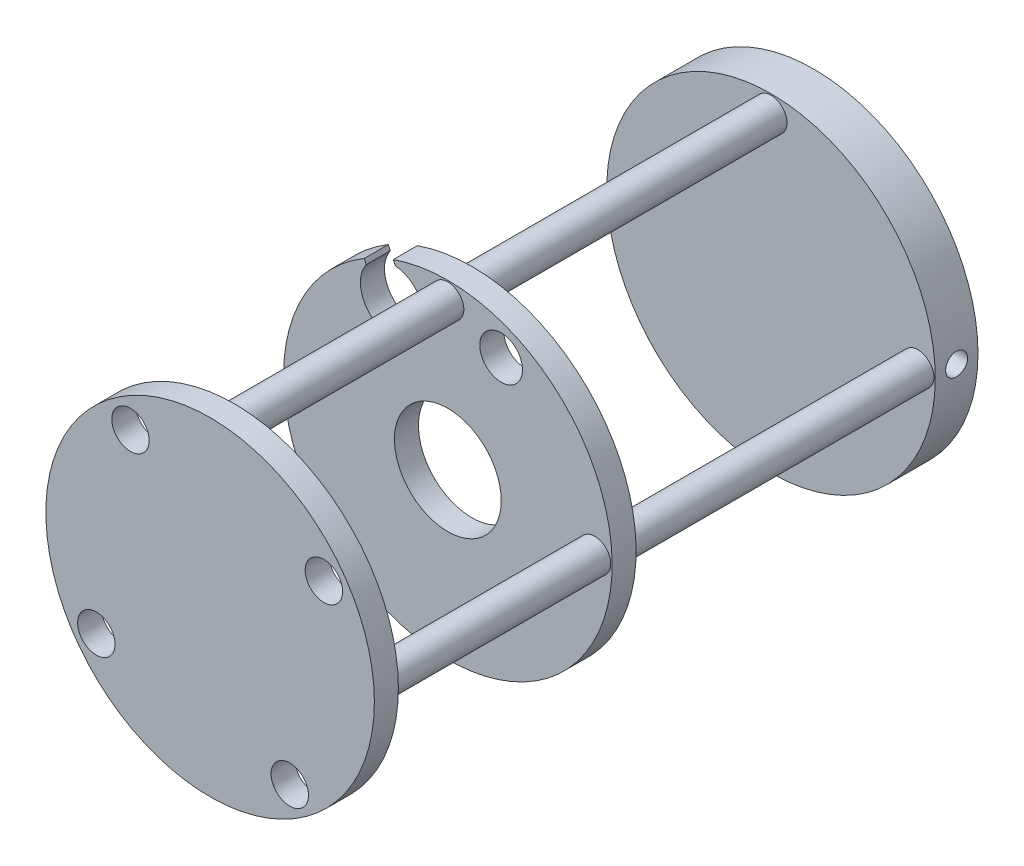
ISO-10303-21;
HEADER;
FILE_DESCRIPTION(('STEP AP214'),'2;1');
FILE_NAME('part.step','',(''),(''),'','','');
FILE_SCHEMA(('AUTOMOTIVE_DESIGN { 1 0 10303 214 1 1 1 1 }'));
ENDSEC;
DATA;
#1=APPLICATION_CONTEXT('core data for automotive mechanical design processes');
#2=APPLICATION_PROTOCOL_DEFINITION('international standard','automotive_design',2000,#1);
#3=PRODUCT_CONTEXT('',#1,'mechanical');
#4=PRODUCT('Part','Part','',(#3));
#5=PRODUCT_RELATED_PRODUCT_CATEGORY('part','',(#4));
#6=PRODUCT_DEFINITION_FORMATION('','',#4);
#7=PRODUCT_DEFINITION_CONTEXT('part definition',#1,'design');
#8=PRODUCT_DEFINITION('design','',#6,#7);
#9=PRODUCT_DEFINITION_SHAPE('','',#8);
#10=(LENGTH_UNIT() NAMED_UNIT(*) SI_UNIT(.MILLI.,.METRE.));
#11=(NAMED_UNIT(*) PLANE_ANGLE_UNIT() SI_UNIT($,.RADIAN.));
#12=(NAMED_UNIT(*) SI_UNIT($,.STERADIAN.) SOLID_ANGLE_UNIT());
#13=UNCERTAINTY_MEASURE_WITH_UNIT(LENGTH_MEASURE(1.E-05),#10,'distance_accuracy_value','');
#14=(GEOMETRIC_REPRESENTATION_CONTEXT(3) GLOBAL_UNCERTAINTY_ASSIGNED_CONTEXT((#13)) GLOBAL_UNIT_ASSIGNED_CONTEXT((#10,
#11,#12)) REPRESENTATION_CONTEXT('',''));
#15=CARTESIAN_POINT('',(0.,0.,0.));
#16=DIRECTION('',(0.,0.,1.));
#17=DIRECTION('',(1.,0.,0.));
#18=AXIS2_PLACEMENT_3D('',#15,#16,#17);
#19=CARTESIAN_POINT('',(0.,0.,8.));
#20=DIRECTION('',(0.,0.,-1.));
#21=DIRECTION('',(-1.,0.,0.));
#22=AXIS2_PLACEMENT_3D('',#19,#20,#21);
#23=CYLINDRICAL_SURFACE('',#22,30.75);
#24=CARTESIAN_POINT('',(30.7489837230436,0.249999999999997,6.05));
#25=CARTESIAN_POINT('',(30.7480473841755,0.365054128626898,6.04999493741304));
#26=CARTESIAN_POINT('',(30.7464595504185,0.480183356898924,6.04028147835291));
#27=CARTESIAN_POINT('',(30.7420759657299,0.70725092235472,6.00167772018999));
#28=CARTESIAN_POINT('',(30.7392788091532,0.819185384237812,5.97276508408072));
#29=CARTESIAN_POINT('',(30.7327170546429,1.03654210733708,5.89660217410777));
#30=CARTESIAN_POINT('',(30.7289529880111,1.14196790562595,5.84936196370515));
#31=CARTESIAN_POINT('',(30.7208080442409,1.34336287169728,5.73790185489006));
#32=CARTESIAN_POINT('',(30.7164273071522,1.43933417826457,5.67368580889602));
#33=CARTESIAN_POINT('',(30.7074665261803,1.61930382289991,5.52996392432266));
#34=CARTESIAN_POINT('',(30.7028861621272,1.70328192874572,5.45043276802647));
#35=CARTESIAN_POINT('',(30.6939906982729,1.85670568438727,5.27839038628644));
#36=CARTESIAN_POINT('',(30.6896756094502,1.92615073300704,5.18587862414982));
#37=CARTESIAN_POINT('',(30.6817472464589,2.04857651082416,4.99041882489982));
#38=CARTESIAN_POINT('',(30.6781344558778,2.10154591019618,4.88746367040535));
#39=CARTESIAN_POINT('',(30.6719874807874,2.18943747033299,4.67408844482033));
#40=CARTESIAN_POINT('',(30.6694532797991,2.22435990682588,4.56366848780892));
#41=CARTESIAN_POINT('',(30.6657313815876,2.27509811922697,4.33873693819937));
#42=CARTESIAN_POINT('',(30.6645409552107,2.29095262565975,4.22423412769942));
#43=CARTESIAN_POINT('',(30.6636216606051,2.30322523239106,3.99418671987999));
#44=CARTESIAN_POINT('',(30.663892770287,2.29964362644485,3.87864213833208));
#45=CARTESIAN_POINT('',(30.6658661897426,2.27317453323833,3.6500275243571));
#46=CARTESIAN_POINT('',(30.6675657177658,2.25032456954983,3.53695312022455));
#47=CARTESIAN_POINT('',(30.6722157746009,2.18602601260693,3.31624955925269));
#48=CARTESIAN_POINT('',(30.675166312463,2.14457728480312,3.20862044181259));
#49=CARTESIAN_POINT('',(30.6820174951758,2.04421671508385,3.00174304787194));
#50=CARTESIAN_POINT('',(30.6859190555858,1.98528803310192,2.9025029723313));
#51=CARTESIAN_POINT('',(30.694272171217,1.85165410524363,2.71530955281524));
#52=CARTESIAN_POINT('',(30.6987237351484,1.77694860949601,2.62735638763601));
#53=CARTESIAN_POINT('',(30.7077396761418,1.61366361834007,2.46500521880112));
#54=CARTESIAN_POINT('',(30.7123043047292,1.525050304628,2.39064123847332));
#55=CARTESIAN_POINT('',(30.7210827738481,1.33658420379989,2.25783933765293));
#56=CARTESIAN_POINT('',(30.7252966132673,1.23673138104904,2.19940146765601));
#57=CARTESIAN_POINT('',(30.7329694296527,1.02855778113563,2.10009124598507));
#58=CARTESIAN_POINT('',(30.7364280592544,0.920233138276761,2.05922696907439));
#59=CARTESIAN_POINT('',(30.742272115125,0.698230599520152,1.99627827655653));
#60=CARTESIAN_POINT('',(30.7446575557344,0.584552775177604,1.97419361000019));
#61=CARTESIAN_POINT('',(30.7481603466494,0.355312368791692,1.94946995787845));
#62=CARTESIAN_POINT('',(30.7492802181731,0.23975400090079,1.9467922526643));
#63=CARTESIAN_POINT('',(30.7502133745382,0.00982131862332939,1.96086276194988));
#64=CARTESIAN_POINT('',(30.75002667067,-0.10455300598602,1.97761080859022));
#65=CARTESIAN_POINT('',(30.7484471707666,-0.328708089432933,2.03001849822155));
#66=CARTESIAN_POINT('',(30.7470560271616,-0.438494925841157,2.06565220507788));
#67=CARTESIAN_POINT('',(30.7433010703666,-0.650534009322303,2.15479927119378));
#68=CARTESIAN_POINT('',(30.7409372499141,-0.752786200132166,2.20831276394962));
#69=CARTESIAN_POINT('',(30.7355688483695,-0.946977898422493,2.33176846144646));
#70=CARTESIAN_POINT('',(30.7325635651184,-1.03890593520102,2.40172867770182));
#71=CARTESIAN_POINT('',(30.7263141116997,-1.20972803116623,2.55606631294425));
#72=CARTESIAN_POINT('',(30.7230699389461,-1.2886219492309,2.64044388800974));
#73=CARTESIAN_POINT('',(30.7167560690092,-1.43126410991758,2.82138082271521));
#74=CARTESIAN_POINT('',(30.7136866586254,-1.49498797300933,2.91795941425343));
#75=CARTESIAN_POINT('',(30.7081181565923,-1.60531737590719,3.12045923526309));
#76=CARTESIAN_POINT('',(30.7056190624331,-1.65192299104779,3.22638042361682));
#77=CARTESIAN_POINT('',(30.7015067762808,-1.72667083191642,3.4445183918588));
#78=CARTESIAN_POINT('',(30.6998932309062,-1.75482042346256,3.55673264074614));
#79=CARTESIAN_POINT('',(30.6977527376575,-1.7918779765724,3.78430449295607));
#80=CARTESIAN_POINT('',(30.6972257802736,-1.80078610653878,3.89966206875909));
#81=CARTESIAN_POINT('',(30.6973242668487,-1.79910618531107,4.13005704822733));
#82=CARTESIAN_POINT('',(30.697947945305,-1.78854800268722,4.24509467161267));
#83=CARTESIAN_POINT('',(30.7002664173102,-1.74829707458787,4.47176083829171));
#84=CARTESIAN_POINT('',(30.7019612132084,-1.71860428714379,4.58338937410759));
#85=CARTESIAN_POINT('',(30.7062101199798,-1.64093340634149,4.80007323563779));
#86=CARTESIAN_POINT('',(30.7087642249203,-1.59295543922253,4.90512860672684));
#87=CARTESIAN_POINT('',(30.7144110137768,-1.48007948065531,5.10569745769102));
#88=CARTESIAN_POINT('',(30.7175036834804,-1.41518193568301,5.20121118926017));
#89=CARTESIAN_POINT('',(30.7238401748803,-1.27019789725713,5.38013639454667));
#90=CARTESIAN_POINT('',(30.7270842055362,-1.19008990734682,5.46353044179988));
#91=CARTESIAN_POINT('',(30.7332999763342,-1.01698422131257,5.61571454061052));
#92=CARTESIAN_POINT('',(30.7362716505374,-0.923983417394737,5.68450106089287));
#93=CARTESIAN_POINT('',(30.7415460842534,-0.727660177339493,5.80554619705098));
#94=CARTESIAN_POINT('',(30.7438482290039,-0.624328371496823,5.85778962693267));
#95=CARTESIAN_POINT('',(30.747446232742,-0.410420647607896,5.94412377293829));
#96=CARTESIAN_POINT('',(30.7487432685566,-0.299853366250004,5.97823570349058));
#97=CARTESIAN_POINT('',(30.7498673098793,-0.115509933032948,6.01849276640713));
#98=CARTESIAN_POINT('',(30.7500567064319,-0.0429216187633697,6.03029299784674));
#99=CARTESIAN_POINT('',(30.7499138500759,0.103100924956617,6.04604822404568));
#100=CARTESIAN_POINT('',(30.7495815980837,0.176535152921034,6.05000323258436));
#101=CARTESIAN_POINT('',(30.7489837230436,0.249999999999997,6.05));
#102=B_SPLINE_CURVE_WITH_KNOTS('',3,(#24,#25,#26,#27,#28,#29,#30,#31,#32,#33,#34,#35,#36,#37,
#38,#39,#40,#41,#42,#43,#44,#45,#46,#47,#48,#49,#50,#51,#52,#53,#54,#55,#56,#57,#58,#59,#60,#61,
#62,#63,#64,#65,#66,#67,#68,#69,#70,#71,#72,#73,#74,#75,#76,#77,#78,#79,#80,#81,#82,#83,#84,#85,
#86,#87,#88,#89,#90,#91,#92,#93,#94,#95,#96,#97,#98,#99,#100,#101),.UNSPECIFIED.,.T.,.F.,(4,2,2,
2,2,2,2,2,2,2,2,2,2,2,2,2,2,2,2,2,2,2,2,2,2,2,2,2,2,2,2,2,2,2,2,2,2,2,4),(0.,0.344905467446549,
0.690212914906254,1.03533102573964,1.38037088418192,1.72598610904037,2.07161562782965,
2.41748230318726,2.76334369411085,3.1085013830877,3.45365385540393,3.79813571928113,
4.14262007529075,4.48743738900244,4.83226016429835,5.17793478705619,5.5236105058048,
5.86944488732811,6.21527464744517,6.56041423756808,6.90555084533584,7.25021469217384,
7.59488111244116,7.93992676471648,8.28497615259879,8.63057637538304,8.97617507722166,
9.32163576616507,9.66709343159923,10.0120214774385,10.3569502798225,10.7018767008914,
11.0467940209192,11.3922024800337,11.7376943445918,12.0835024456457,12.4289050446318,
12.6491359240413,12.8693664166369),.UNSPECIFIED.);
#103=CARTESIAN_POINT('',(30.7489837230436,0.249999999999997,6.05));
#104=VERTEX_POINT('',#103);
#105=EDGE_CURVE('E157',#104,#104,#102,.T.);
#106=ORIENTED_EDGE('',*,*,#105,.T.);
#107=EDGE_LOOP('',(#106));
#108=FACE_BOUND('',#107,.T.);
#109=CARTESIAN_POINT('',(-30.75,0.,6.03469899493758));
#110=CARTESIAN_POINT('',(-30.7499991569928,-0.114182970529061,6.02066443587242));
#111=CARTESIAN_POINT('',(-30.7493573958681,-0.227261893721089,5.99698615917373));
#112=CARTESIAN_POINT('',(-30.7469361737667,-0.447924968709638,5.93098225836839));
#113=CARTESIAN_POINT('',(-30.745155388456,-0.555502566715208,5.88863494576224));
#114=CARTESIAN_POINT('',(-30.7407313762978,-0.761968021183546,5.78652500612322));
#115=CARTESIAN_POINT('',(-30.7380886104552,-0.860860486828509,5.72677169000028));
#116=CARTESIAN_POINT('',(-30.7323053804257,-1.04719155619179,5.59155399590492));
#117=CARTESIAN_POINT('',(-30.7291650304844,-1.13463278072514,5.51609322312978));
#118=CARTESIAN_POINT('',(-30.7227942177098,-1.29573851013687,5.35147092091243));
#119=CARTESIAN_POINT('',(-30.7195636375875,-1.36938402346344,5.262290808001));
#120=CARTESIAN_POINT('',(-30.7134307999628,-1.50066727510562,5.07282251795252));
#121=CARTESIAN_POINT('',(-30.7105285548578,-1.55830440909292,4.97253392166175));
#122=CARTESIAN_POINT('',(-30.7054189124962,-1.65594460042698,4.76365566948334));
#123=CARTESIAN_POINT('',(-30.703211732416,-1.69594214775998,4.6550634322288));
#124=CARTESIAN_POINT('',(-30.6997709361764,-1.75713176080577,4.43268960657363));
#125=CARTESIAN_POINT('',(-30.6985373084593,-1.77832404976984,4.3189080797958));
#126=CARTESIAN_POINT('',(-30.6971991157951,-1.80127773182749,4.08956386773195));
#127=CARTESIAN_POINT('',(-30.6970928989197,-1.80306755428817,3.9740040369815));
#128=CARTESIAN_POINT('',(-30.6980184724104,-1.78723880093902,3.74422669501866));
#129=CARTESIAN_POINT('',(-30.6990502558511,-1.76962034323859,3.63000917564189));
#130=CARTESIAN_POINT('',(-30.7021218698563,-1.71549968341927,3.40623858483636));
#131=CARTESIAN_POINT('',(-30.7041610005304,-1.67901059152043,3.29668233214614));
#132=CARTESIAN_POINT('',(-30.708991969214,-1.58819652332006,3.08524765889216));
#133=CARTESIAN_POINT('',(-30.7117838148895,-1.53387136536499,2.98336931653799));
#134=CARTESIAN_POINT('',(-30.7177726968115,-1.40884621285753,2.79004232960044));
#135=CARTESIAN_POINT('',(-30.720970238723,-1.33812569031545,2.69860697629437));
#136=CARTESIAN_POINT('',(-30.7273594016084,-1.18234736512807,2.52889549956932));
#137=CARTESIAN_POINT('',(-30.7305510225406,-1.09728946169038,2.45061946866865));
#138=CARTESIAN_POINT('',(-30.7365143772867,-0.915139694690968,2.30936513804578));
#139=CARTESIAN_POINT('',(-30.7392856598498,-0.818035098903794,2.24640323554169));
#140=CARTESIAN_POINT('',(-30.7440252096972,-0.614614377883046,2.13767834725366));
#141=CARTESIAN_POINT('',(-30.7459934831296,-0.508298323183734,2.09191522978897));
#142=CARTESIAN_POINT('',(-30.748830450333,-0.289592287427553,2.01893576584422));
#143=CARTESIAN_POINT('',(-30.7497003147114,-0.177208905970766,1.99169968885053));
#144=CARTESIAN_POINT('',(-30.7501692314872,0.0505368838593607,1.95647576204697));
#145=CARTESIAN_POINT('',(-30.749768298726,0.165899257425896,1.94848768744452));
#146=CARTESIAN_POINT('',(-30.747663564754,0.3961276356834,1.9519815224564));
#147=CARTESIAN_POINT('',(-30.7459618879557,0.510994142919063,1.96343172211372));
#148=CARTESIAN_POINT('',(-30.7413709980339,0.737162324927676,2.00540691921793));
#149=CARTESIAN_POINT('',(-30.738481780702,0.848463987066605,2.0359319842594));
#150=CARTESIAN_POINT('',(-30.731762200261,1.0644147167128,2.11520145889451));
#151=CARTESIAN_POINT('',(-30.7279313335929,1.16906018692357,2.16395562402285));
#152=CARTESIAN_POINT('',(-30.7196873056816,1.36868754823397,2.27829450170634));
#153=CARTESIAN_POINT('',(-30.7152741357097,1.4636692944367,2.34387946656888));
#154=CARTESIAN_POINT('',(-30.7062852512765,1.64149456204707,2.49018917866061));
#155=CARTESIAN_POINT('',(-30.701709203009,1.72431113285278,2.57094666375384));
#156=CARTESIAN_POINT('',(-30.6928620899002,1.87521880462202,2.74522879527891));
#157=CARTESIAN_POINT('',(-30.6885910265569,1.94330983326622,2.83875350440882));
#158=CARTESIAN_POINT('',(-30.6807868494609,2.062867787406,3.03598921789491));
#159=CARTESIAN_POINT('',(-30.6772541644697,2.11432506344159,3.13970608953343));
#160=CARTESIAN_POINT('',(-30.6712950230648,2.19908572184384,3.35433966724277));
#161=CARTESIAN_POINT('',(-30.6688685496125,2.23238938382622,3.46525626238854));
#162=CARTESIAN_POINT('',(-30.6653785445216,2.27983106413438,3.69089118164161));
#163=CARTESIAN_POINT('',(-30.6643121442902,2.29400942416699,3.80560097896125));
#164=CARTESIAN_POINT('',(-30.6636442090908,2.30292102355583,4.0357771230282));
#165=CARTESIAN_POINT('',(-30.6640426582197,2.29765447401483,4.15124346154859));
#166=CARTESIAN_POINT('',(-30.666260635535,2.26785731700607,4.37942962177913));
#167=CARTESIAN_POINT('',(-30.6680775263364,2.24336246129988,4.49215414081257));
#168=CARTESIAN_POINT('',(-30.6729405311939,2.17585734342039,4.71188743749501));
#169=CARTESIAN_POINT('',(-30.6759866560334,2.13284691881938,4.81889616499302));
#170=CARTESIAN_POINT('',(-30.6829982366629,2.02948090495911,5.02429534105205));
#171=CARTESIAN_POINT('',(-30.6869647105355,1.96910608950611,5.12267607810175));
#172=CARTESIAN_POINT('',(-30.6954100604739,1.83274444542021,5.30791706864392));
#173=CARTESIAN_POINT('',(-30.6998889257447,1.75675794566255,5.39477756475798));
#174=CARTESIAN_POINT('',(-30.7089193030603,1.59111778152941,5.55473153295747));
#175=CARTESIAN_POINT('',(-30.7134709610586,1.50143242715702,5.62779218158711));
#176=CARTESIAN_POINT('',(-30.7221869098359,1.31102947714312,5.75784216678903));
#177=CARTESIAN_POINT('',(-30.7263511072344,1.21030923469561,5.81482763583252));
#178=CARTESIAN_POINT('',(-30.7338941100782,1.000631250314,5.91111958250541));
#179=CARTESIAN_POINT('',(-30.7372722932039,0.891667071152619,5.95041207474674));
#180=CARTESIAN_POINT('',(-30.7429287371227,0.668743570724911,6.01008402077575));
#181=CARTESIAN_POINT('',(-30.7452082849948,0.554790265987842,6.03048563166126));
#182=CARTESIAN_POINT('',(-30.7478996557481,0.366821345216907,6.04799131259232));
#183=CARTESIAN_POINT('',(-30.7486889666146,0.293299423069049,6.05085922981602));
#184=CARTESIAN_POINT('',(-30.7497394074834,0.146368083060356,6.04869684251469));
#185=CARTESIAN_POINT('',(-30.7500005386502,0.0729586649518082,6.04366655540511));
#186=CARTESIAN_POINT('',(-30.75,0.,6.03469899493758));
#187=B_SPLINE_CURVE_WITH_KNOTS('',3,(#109,#110,#111,#112,#113,#114,#115,#116,#117,#118,#119,
#120,#121,#122,#123,#124,#125,#126,#127,#128,#129,#130,#131,#132,#133,#134,#135,#136,#137,#138,
#139,#140,#141,#142,#143,#144,#145,#146,#147,#148,#149,#150,#151,#152,#153,#154,#155,#156,#157,
#158,#159,#160,#161,#162,#163,#164,#165,#166,#167,#168,#169,#170,#171,#172,#173,#174,#175,#176,
#177,#178,#179,#180,#181,#182,#183,#184,#185,#186),.UNSPECIFIED.,.T.,.F.,(4,2,2,2,2,2,2,2,2,2,2,
2,2,2,2,2,2,2,2,2,2,2,2,2,2,2,2,2,2,2,2,2,2,2,2,2,2,2,4),(0.,0.344858325441614,
0.690118345476824,1.03519401531944,1.38019057007547,1.72565862129241,2.07113971241521,
2.41672864391039,2.76231347260602,3.10739186629636,3.45246816001839,3.79730503620584,
4.14214542453485,4.48741992826625,4.83269685939297,5.17834187553776,5.5239842452329,
5.86925794173334,6.2145276058494,6.5592345673123,6.90394275030181,7.24883567291501,
7.59373376605583,7.93938477785374,8.28503748715707,8.63089035581322,8.97673789723087,
9.32185478286438,9.66696792176333,10.0114408970547,10.3559168942944,10.7007757801934,
11.045627402051,11.3912892126495,11.737034115262,12.0830518337418,12.4286631923538,
12.6490153025118,12.8693669267966),.UNSPECIFIED.);
#188=CARTESIAN_POINT('',(-30.75,0.,6.03469899493758));
#189=VERTEX_POINT('',#188);
#190=EDGE_CURVE('E11',#189,#189,#187,.T.);
#191=ORIENTED_EDGE('',*,*,#190,.T.);
#192=EDGE_LOOP('',(#191));
#193=FACE_BOUND('',#192,.T.);
#194=CARTESIAN_POINT('',(0.,0.,8.));
#195=DIRECTION('',(0.,0.,1.));
#196=DIRECTION('',(1.,0.,0.));
#197=AXIS2_PLACEMENT_3D('',#194,#195,#196);
#198=CIRCLE('',#197,30.75);
#199=CARTESIAN_POINT('',(30.75,0.,8.));
#200=VERTEX_POINT('',#199);
#201=EDGE_CURVE('E135',#200,#200,#198,.T.);
#202=ORIENTED_EDGE('',*,*,#201,.F.);
#203=EDGE_LOOP('',(#202));
#204=FACE_BOUND('',#203,.T.);
#205=CARTESIAN_POINT('',(0.,0.,0.));
#206=DIRECTION('',(0.,0.,1.));
#207=DIRECTION('',(1.,0.,0.));
#208=AXIS2_PLACEMENT_3D('',#205,#206,#207);
#209=CIRCLE('',#208,30.75);
#210=CARTESIAN_POINT('',(30.75,0.,0.));
#211=VERTEX_POINT('',#210);
#212=EDGE_CURVE('E132',#211,#211,#209,.T.);
#213=ORIENTED_EDGE('',*,*,#212,.T.);
#214=EDGE_LOOP('',(#213));
#215=FACE_BOUND('',#214,.T.);
#216=ADVANCED_FACE('F37',(#108,#193,#204,#215),#23,.T.);
#217=CARTESIAN_POINT('',(0.,0.,8.));
#218=DIRECTION('',(0.,0.,1.));
#219=DIRECTION('',(1.,0.,0.));
#220=AXIS2_PLACEMENT_3D('',#217,#218,#219);
#221=PLANE('',#220);
#222=CARTESIAN_POINT('',(0.,-27.5,8.));
#223=DIRECTION('',(0.,0.,1.));
#224=DIRECTION('',(1.,0.,0.));
#225=AXIS2_PLACEMENT_3D('',#222,#223,#224);
#226=CIRCLE('',#225,3.);
#227=CARTESIAN_POINT('',(3.,-27.5,8.));
#228=VERTEX_POINT('',#227);
#229=EDGE_CURVE('E102',#228,#228,#226,.T.);
#230=ORIENTED_EDGE('',*,*,#229,.F.);
#231=EDGE_LOOP('',(#230));
#232=FACE_BOUND('',#231,.T.);
#233=CARTESIAN_POINT('',(-27.5,0.,8.));
#234=DIRECTION('',(0.,0.,1.));
#235=DIRECTION('',(1.,0.,0.));
#236=AXIS2_PLACEMENT_3D('',#233,#234,#235);
#237=CIRCLE('',#236,3.);
#238=CARTESIAN_POINT('',(-24.5,0.,8.));
#239=VERTEX_POINT('',#238);
#240=EDGE_CURVE('E115',#239,#239,#237,.T.);
#241=ORIENTED_EDGE('',*,*,#240,.F.);
#242=EDGE_LOOP('',(#241));
#243=FACE_BOUND('',#242,.T.);
#244=CARTESIAN_POINT('',(27.5,0.,8.));
#245=DIRECTION('',(0.,0.,1.));
#246=DIRECTION('',(1.,0.,0.));
#247=AXIS2_PLACEMENT_3D('',#244,#245,#246);
#248=CIRCLE('',#247,3.);
#249=CARTESIAN_POINT('',(30.5,0.,8.));
#250=VERTEX_POINT('',#249);
#251=EDGE_CURVE('E120',#250,#250,#248,.T.);
#252=ORIENTED_EDGE('',*,*,#251,.F.);
#253=EDGE_LOOP('',(#252));
#254=FACE_BOUND('',#253,.T.);
#255=CARTESIAN_POINT('',(0.,27.5,8.));
#256=DIRECTION('',(0.,0.,1.));
#257=DIRECTION('',(1.,0.,0.));
#258=AXIS2_PLACEMENT_3D('',#255,#256,#257);
#259=CIRCLE('',#258,3.);
#260=CARTESIAN_POINT('',(3.,27.5,8.));
#261=VERTEX_POINT('',#260);
#262=EDGE_CURVE('E126',#261,#261,#259,.T.);
#263=ORIENTED_EDGE('',*,*,#262,.F.);
#264=EDGE_LOOP('',(#263));
#265=FACE_BOUND('',#264,.T.);
#266=ORIENTED_EDGE('',*,*,#201,.T.);
#267=EDGE_LOOP('',(#266));
#268=FACE_BOUND('',#267,.T.);
#269=ADVANCED_FACE('F242',(#232,#243,#254,#265,#268),#221,.T.);
#270=CARTESIAN_POINT('',(0.,0.,0.));
#271=DIRECTION('',(0.,0.,1.));
#272=DIRECTION('',(1.,0.,0.));
#273=AXIS2_PLACEMENT_3D('',#270,#271,#272);
#274=PLANE('',#273);
#275=ORIENTED_EDGE('',*,*,#212,.F.);
#276=EDGE_LOOP('',(#275));
#277=FACE_BOUND('',#276,.T.);
#278=ADVANCED_FACE('F240',(#277),#274,.F.);
#279=CARTESIAN_POINT('',(0.,27.5,64.));
#280=DIRECTION('',(0.,0.,-1.));
#281=DIRECTION('',(-1.,0.,0.));
#282=AXIS2_PLACEMENT_3D('',#279,#280,#281);
#283=CYLINDRICAL_SURFACE('',#282,3.);
#284=CARTESIAN_POINT('',(0.,27.5,64.));
#285=DIRECTION('',(0.,0.,1.));
#286=DIRECTION('',(1.,0.,0.));
#287=AXIS2_PLACEMENT_3D('',#284,#285,#286);
#288=CIRCLE('',#287,3.);
#289=CARTESIAN_POINT('',(3.,27.5,64.));
#290=VERTEX_POINT('',#289);
#291=EDGE_CURVE('E129',#290,#290,#288,.T.);
#292=ORIENTED_EDGE('',*,*,#291,.F.);
#293=EDGE_LOOP('',(#292));
#294=FACE_BOUND('',#293,.T.);
#295=ORIENTED_EDGE('',*,*,#262,.T.);
#296=EDGE_LOOP('',(#295));
#297=FACE_BOUND('',#296,.T.);
#298=ADVANCED_FACE('F236',(#294,#297),#283,.T.);
#299=CARTESIAN_POINT('',(27.5,0.,64.));
#300=DIRECTION('',(0.,0.,-1.));
#301=DIRECTION('',(-1.,0.,0.));
#302=AXIS2_PLACEMENT_3D('',#299,#300,#301);
#303=CYLINDRICAL_SURFACE('',#302,3.);
#304=CARTESIAN_POINT('',(27.5,0.,64.));
#305=DIRECTION('',(0.,0.,1.));
#306=DIRECTION('',(1.,0.,0.));
#307=AXIS2_PLACEMENT_3D('',#304,#305,#306);
#308=CIRCLE('',#307,3.);
#309=CARTESIAN_POINT('',(30.5,0.,64.));
#310=VERTEX_POINT('',#309);
#311=EDGE_CURVE('E123',#310,#310,#308,.T.);
#312=ORIENTED_EDGE('',*,*,#311,.F.);
#313=EDGE_LOOP('',(#312));
#314=FACE_BOUND('',#313,.T.);
#315=ORIENTED_EDGE('',*,*,#251,.T.);
#316=EDGE_LOOP('',(#315));
#317=FACE_BOUND('',#316,.T.);
#318=ADVANCED_FACE('F232',(#314,#317),#303,.T.);
#319=CARTESIAN_POINT('',(-27.5,0.,64.));
#320=DIRECTION('',(0.,0.,-1.));
#321=DIRECTION('',(-1.,0.,0.));
#322=AXIS2_PLACEMENT_3D('',#319,#320,#321);
#323=CYLINDRICAL_SURFACE('',#322,3.);
#324=CARTESIAN_POINT('',(-27.5,0.,64.));
#325=DIRECTION('',(0.,0.,1.));
#326=DIRECTION('',(1.,0.,0.));
#327=AXIS2_PLACEMENT_3D('',#324,#325,#326);
#328=CIRCLE('',#327,3.);
#329=CARTESIAN_POINT('',(-24.5,0.,64.));
#330=VERTEX_POINT('',#329);
#331=EDGE_CURVE('E117',#330,#330,#328,.T.);
#332=ORIENTED_EDGE('',*,*,#331,.F.);
#333=EDGE_LOOP('',(#332));
#334=FACE_BOUND('',#333,.T.);
#335=ORIENTED_EDGE('',*,*,#240,.T.);
#336=EDGE_LOOP('',(#335));
#337=FACE_BOUND('',#336,.T.);
#338=ADVANCED_FACE('F228',(#334,#337),#323,.T.);
#339=CARTESIAN_POINT('',(0.,-27.5,64.));
#340=DIRECTION('',(0.,0.,-1.));
#341=DIRECTION('',(-1.,0.,0.));
#342=AXIS2_PLACEMENT_3D('',#339,#340,#341);
#343=CYLINDRICAL_SURFACE('',#342,3.);
#344=CARTESIAN_POINT('',(0.,-27.5,64.));
#345=DIRECTION('',(0.,0.,1.));
#346=DIRECTION('',(1.,0.,0.));
#347=AXIS2_PLACEMENT_3D('',#344,#345,#346);
#348=CIRCLE('',#347,3.);
#349=CARTESIAN_POINT('',(3.,-27.5,64.));
#350=VERTEX_POINT('',#349);
#351=EDGE_CURVE('E106',#350,#350,#348,.T.);
#352=ORIENTED_EDGE('',*,*,#351,.F.);
#353=EDGE_LOOP('',(#352));
#354=FACE_BOUND('',#353,.T.);
#355=ORIENTED_EDGE('',*,*,#229,.T.);
#356=EDGE_LOOP('',(#355));
#357=FACE_BOUND('',#356,.T.);
#358=ADVANCED_FACE('F225',(#354,#357),#343,.T.);
#359=CARTESIAN_POINT('',(0.,0.,68.5));
#360=DIRECTION('',(0.,0.,-1.));
#361=DIRECTION('',(-1.,0.,0.));
#362=AXIS2_PLACEMENT_3D('',#359,#360,#361);
#363=CYLINDRICAL_SURFACE('',#362,30.75);
#364=CARTESIAN_POINT('',(0.,0.,64.));
#365=DIRECTION('',(0.,0.,1.));
#366=DIRECTION('',(1.,0.,0.));
#367=AXIS2_PLACEMENT_3D('',#364,#365,#366);
#368=CIRCLE('',#367,30.75);
#369=CARTESIAN_POINT('',(-15.652440464028,26.4681621485146,64.));
#370=VERTEX_POINT('',#369);
#371=CARTESIAN_POINT('',(-10.214593741808,29.0038717189588,64.));
#372=VERTEX_POINT('',#371);
#373=EDGE_CURVE('E103',#370,#372,#368,.T.);
#374=ORIENTED_EDGE('',*,*,#373,.T.);
#375=DIRECTION('',(0.,0.,1.));
#376=VECTOR('',#375,1.);
#377=CARTESIAN_POINT('',(-10.214593741808,29.0038717189588,58.5));
#378=LINE('',#377,#376);
#379=CARTESIAN_POINT('',(-10.214593741808,29.0038717189588,68.5));
#380=VERTEX_POINT('',#379);
#381=EDGE_CURVE('E62',#372,#380,#378,.T.);
#382=ORIENTED_EDGE('',*,*,#381,.T.);
#383=CARTESIAN_POINT('',(0.,0.,68.5));
#384=DIRECTION('',(0.,0.,1.));
#385=DIRECTION('',(1.,0.,0.));
#386=AXIS2_PLACEMENT_3D('',#383,#384,#385);
#387=CIRCLE('',#386,30.75);
#388=CARTESIAN_POINT('',(-15.652440464028,26.4681621485146,68.5));
#389=VERTEX_POINT('',#388);
#390=EDGE_CURVE('E96',#389,#380,#387,.T.);
#391=ORIENTED_EDGE('',*,*,#390,.F.);
#392=DIRECTION('',(0.,0.,1.));
#393=VECTOR('',#392,1.);
#394=CARTESIAN_POINT('',(-15.652440464028,26.4681621485146,58.5));
#395=LINE('',#394,#393);
#396=EDGE_CURVE('E78',#370,#389,#395,.T.);
#397=ORIENTED_EDGE('',*,*,#396,.F.);
#398=EDGE_LOOP('',(#374,#382,#391,#397));
#399=FACE_BOUND('',#398,.T.);
#400=ADVANCED_FACE('F101',(#399),#363,.T.);
#401=CARTESIAN_POINT('',(0.,0.,68.5));
#402=DIRECTION('',(0.,0.,1.));
#403=DIRECTION('',(1.,0.,0.));
#404=AXIS2_PLACEMENT_3D('',#401,#402,#403);
#405=PLANE('',#404);
#406=CARTESIAN_POINT('',(0.,0.,68.5));
#407=DIRECTION('',(0.,0.,1.));
#408=DIRECTION('',(1.,0.,0.));
#409=AXIS2_PLACEMENT_3D('',#406,#407,#408);
#410=CIRCLE('',#409,10.);
#411=CARTESIAN_POINT('',(10.,0.,68.5));
#412=VERTEX_POINT('',#411);
#413=EDGE_CURVE('E151',#412,#412,#410,.T.);
#414=ORIENTED_EDGE('',*,*,#413,.F.);
#415=EDGE_LOOP('',(#414));
#416=FACE_BOUND('',#415,.T.);
#417=DIRECTION('',(-0.422618261740692,0.906307787036653,0.));
#418=VECTOR('',#417,1.);
#419=CARTESIAN_POINT('',(-10.214593741808,29.0038717189588,68.5));
#420=LINE('',#419,#418);
#421=CARTESIAN_POINT('',(-9.83121295616107,28.1817089709485,68.5));
#422=VERTEX_POINT('',#421);
#423=EDGE_CURVE('E89',#422,#380,#420,.T.);
#424=ORIENTED_EDGE('',*,*,#423,.F.);
#425=CARTESIAN_POINT('',(-10.354147412647,22.204540782398,68.5));
#426=DIRECTION('',(0.,0.,1.));
#427=DIRECTION('',(1.,0.,0.));
#428=AXIS2_PLACEMENT_3D('',#425,#426,#427);
#429=CIRCLE('',#428,6.);
#430=CARTESIAN_POINT('',(-15.269059678381,25.6459994005043,68.5));
#431=VERTEX_POINT('',#430);
#432=EDGE_CURVE('E98',#431,#422,#429,.T.);
#433=ORIENTED_EDGE('',*,*,#432,.F.);
#434=DIRECTION('',(0.422618261740696,-0.906307787036652,0.));
#435=VECTOR('',#434,1.);
#436=CARTESIAN_POINT('',(-15.652440464028,26.4681621485146,68.5));
#437=LINE('',#436,#435);
#438=EDGE_CURVE('E81',#389,#431,#437,.T.);
#439=ORIENTED_EDGE('',*,*,#438,.F.);
#440=ORIENTED_EDGE('',*,*,#390,.T.);
#441=EDGE_LOOP('',(#424,#433,#439,#440));
#442=FACE_BOUND('',#441,.T.);
#443=CARTESIAN_POINT('',(9.98690326969372,23.2244207572088,68.5));
#444=DIRECTION('',(0.,0.,1.));
#445=DIRECTION('',(1.,0.,0.));
#446=AXIS2_PLACEMENT_3D('',#443,#444,#445);
#447=CIRCLE('',#446,4.);
#448=CARTESIAN_POINT('',(13.9869032696937,23.2244207572088,68.5));
#449=VERTEX_POINT('',#448);
#450=EDGE_CURVE('E144',#449,#449,#447,.T.);
#451=ORIENTED_EDGE('',*,*,#450,.F.);
#452=EDGE_LOOP('',(#451));
#453=FACE_BOUND('',#452,.T.);
#454=CARTESIAN_POINT('',(27.5,0.,68.5));
#455=DIRECTION('',(0.,0.,1.));
#456=DIRECTION('',(1.,0.,0.));
#457=AXIS2_PLACEMENT_3D('',#454,#455,#456);
#458=CIRCLE('',#457,3.);
#459=CARTESIAN_POINT('',(30.5,0.,68.5));
#460=VERTEX_POINT('',#459);
#461=EDGE_CURVE('E143',#460,#460,#458,.T.);
#462=ORIENTED_EDGE('',*,*,#461,.F.);
#463=EDGE_LOOP('',(#462));
#464=FACE_BOUND('',#463,.T.);
#465=CARTESIAN_POINT('',(0.,27.5,68.5));
#466=DIRECTION('',(0.,0.,1.));
#467=DIRECTION('',(1.,0.,0.));
#468=AXIS2_PLACEMENT_3D('',#465,#466,#467);
#469=CIRCLE('',#468,3.);
#470=CARTESIAN_POINT('',(3.,27.5,68.5));
#471=VERTEX_POINT('',#470);
#472=EDGE_CURVE('E306',#471,#471,#469,.T.);
#473=ORIENTED_EDGE('',*,*,#472,.F.);
#474=EDGE_LOOP('',(#473));
#475=FACE_BOUND('',#474,.T.);
#476=CARTESIAN_POINT('',(-27.5,0.,68.5));
#477=DIRECTION('',(0.,0.,1.));
#478=DIRECTION('',(1.,0.,0.));
#479=AXIS2_PLACEMENT_3D('',#476,#477,#478);
#480=CIRCLE('',#479,3.);
#481=CARTESIAN_POINT('',(-24.5,0.,68.5));
#482=VERTEX_POINT('',#481);
#483=EDGE_CURVE('E312',#482,#482,#480,.T.);
#484=ORIENTED_EDGE('',*,*,#483,.F.);
#485=EDGE_LOOP('',(#484));
#486=FACE_BOUND('',#485,.T.);
#487=CARTESIAN_POINT('',(0.,-27.5,68.5));
#488=DIRECTION('',(0.,0.,1.));
#489=DIRECTION('',(1.,0.,0.));
#490=AXIS2_PLACEMENT_3D('',#487,#488,#489);
#491=CIRCLE('',#490,3.);
#492=CARTESIAN_POINT('',(3.,-27.5,68.5));
#493=VERTEX_POINT('',#492);
#494=EDGE_CURVE('E111',#493,#493,#491,.T.);
#495=ORIENTED_EDGE('',*,*,#494,.F.);
#496=EDGE_LOOP('',(#495));
#497=FACE_BOUND('',#496,.T.);
#498=ADVANCED_FACE('F94',(#416,#442,#453,#464,#475,#486,#497),#405,.T.);
#499=CARTESIAN_POINT('',(0.,0.,64.));
#500=DIRECTION('',(0.,0.,1.));
#501=DIRECTION('',(1.,0.,0.));
#502=AXIS2_PLACEMENT_3D('',#499,#500,#501);
#503=PLANE('',#502);
#504=CARTESIAN_POINT('',(0.,0.,64.));
#505=DIRECTION('',(0.,0.,1.));
#506=DIRECTION('',(1.,0.,0.));
#507=AXIS2_PLACEMENT_3D('',#504,#505,#506);
#508=CIRCLE('',#507,10.);
#509=CARTESIAN_POINT('',(10.,0.,64.));
#510=VERTEX_POINT('',#509);
#511=EDGE_CURVE('E99',#510,#510,#508,.T.);
#512=ORIENTED_EDGE('',*,*,#511,.T.);
#513=EDGE_LOOP('',(#512));
#514=FACE_BOUND('',#513,.T.);
#515=CARTESIAN_POINT('',(9.98690326969372,23.2244207572088,64.));
#516=DIRECTION('',(0.,0.,1.));
#517=DIRECTION('',(1.,0.,0.));
#518=AXIS2_PLACEMENT_3D('',#515,#516,#517);
#519=CIRCLE('',#518,4.);
#520=CARTESIAN_POINT('',(13.9869032696937,23.2244207572088,64.));
#521=VERTEX_POINT('',#520);
#522=EDGE_CURVE('E140',#521,#521,#519,.T.);
#523=ORIENTED_EDGE('',*,*,#522,.T.);
#524=EDGE_LOOP('',(#523));
#525=FACE_BOUND('',#524,.T.);
#526=ORIENTED_EDGE('',*,*,#291,.T.);
#527=EDGE_LOOP('',(#526));
#528=FACE_BOUND('',#527,.T.);
#529=ORIENTED_EDGE('',*,*,#311,.T.);
#530=EDGE_LOOP('',(#529));
#531=FACE_BOUND('',#530,.T.);
#532=ORIENTED_EDGE('',*,*,#331,.T.);
#533=EDGE_LOOP('',(#532));
#534=FACE_BOUND('',#533,.T.);
#535=ORIENTED_EDGE('',*,*,#351,.T.);
#536=EDGE_LOOP('',(#535));
#537=FACE_BOUND('',#536,.T.);
#538=CARTESIAN_POINT('',(-10.354147412647,22.204540782398,64.));
#539=DIRECTION('',(0.,0.,1.));
#540=DIRECTION('',(1.,0.,0.));
#541=AXIS2_PLACEMENT_3D('',#538,#539,#540);
#542=CIRCLE('',#541,6.);
#543=CARTESIAN_POINT('',(-15.269059678381,25.6459994005043,64.));
#544=VERTEX_POINT('',#543);
#545=CARTESIAN_POINT('',(-9.83121295616107,28.1817089709485,64.));
#546=VERTEX_POINT('',#545);
#547=EDGE_CURVE('E146',#544,#546,#542,.T.);
#548=ORIENTED_EDGE('',*,*,#547,.T.);
#549=DIRECTION('',(-0.422618261740693,0.906307787036653,0.));
#550=VECTOR('',#549,1.);
#551=CARTESIAN_POINT('',(2.71892336110986,1.26785478522203,64.));
#552=LINE('',#551,#550);
#553=EDGE_CURVE('E46',#546,#372,#552,.T.);
#554=ORIENTED_EDGE('',*,*,#553,.T.);
#555=ORIENTED_EDGE('',*,*,#373,.F.);
#556=DIRECTION('',(0.422618261740695,-0.906307787036652,0.));
#557=VECTOR('',#556,1.);
#558=CARTESIAN_POINT('',(-2.71892336110996,-1.26785478522209,64.));
#559=LINE('',#558,#557);
#560=EDGE_CURVE('E84',#370,#544,#559,.T.);
#561=ORIENTED_EDGE('',*,*,#560,.T.);
#562=EDGE_LOOP('',(#548,#554,#555,#561));
#563=FACE_BOUND('',#562,.T.);
#564=ADVANCED_FACE('F215',(#514,#525,#528,#531,#534,#537,#563),#503,.F.);
#565=CARTESIAN_POINT('',(0.,-27.5,108.5));
#566=DIRECTION('',(0.,0.,-1.));
#567=DIRECTION('',(-1.,0.,0.));
#568=AXIS2_PLACEMENT_3D('',#565,#566,#567);
#569=CYLINDRICAL_SURFACE('',#568,3.);
#570=CARTESIAN_POINT('',(0.,-27.5,108.5));
#571=DIRECTION('',(0.,0.,1.));
#572=DIRECTION('',(1.,0.,0.));
#573=AXIS2_PLACEMENT_3D('',#570,#571,#572);
#574=CIRCLE('',#573,3.);
#575=CARTESIAN_POINT('',(3.,-27.5,108.5));
#576=VERTEX_POINT('',#575);
#577=EDGE_CURVE('E108',#576,#576,#574,.T.);
#578=ORIENTED_EDGE('',*,*,#577,.F.);
#579=EDGE_LOOP('',(#578));
#580=FACE_BOUND('',#579,.T.);
#581=ORIENTED_EDGE('',*,*,#494,.T.);
#582=EDGE_LOOP('',(#581));
#583=FACE_BOUND('',#582,.T.);
#584=ADVANCED_FACE('F211',(#580,#583),#569,.T.);
#585=CARTESIAN_POINT('',(-27.5,0.,108.5));
#586=DIRECTION('',(0.,0.,-1.));
#587=DIRECTION('',(-1.,0.,0.));
#588=AXIS2_PLACEMENT_3D('',#585,#586,#587);
#589=CYLINDRICAL_SURFACE('',#588,3.);
#590=CARTESIAN_POINT('',(-27.5,0.,108.5));
#591=DIRECTION('',(0.,0.,1.));
#592=DIRECTION('',(1.,0.,0.));
#593=AXIS2_PLACEMENT_3D('',#590,#591,#592);
#594=CIRCLE('',#593,3.);
#595=CARTESIAN_POINT('',(-24.5,0.,108.5));
#596=VERTEX_POINT('',#595);
#597=EDGE_CURVE('E315',#596,#596,#594,.T.);
#598=ORIENTED_EDGE('',*,*,#597,.F.);
#599=EDGE_LOOP('',(#598));
#600=FACE_BOUND('',#599,.T.);
#601=ORIENTED_EDGE('',*,*,#483,.T.);
#602=EDGE_LOOP('',(#601));
#603=FACE_BOUND('',#602,.T.);
#604=ADVANCED_FACE('F207',(#600,#603),#589,.T.);
#605=CARTESIAN_POINT('',(0.,27.5,108.5));
#606=DIRECTION('',(0.,0.,-1.));
#607=DIRECTION('',(-1.,0.,0.));
#608=AXIS2_PLACEMENT_3D('',#605,#606,#607);
#609=CYLINDRICAL_SURFACE('',#608,3.);
#610=CARTESIAN_POINT('',(0.,27.5,108.5));
#611=DIRECTION('',(0.,0.,1.));
#612=DIRECTION('',(1.,0.,0.));
#613=AXIS2_PLACEMENT_3D('',#610,#611,#612);
#614=CIRCLE('',#613,3.);
#615=CARTESIAN_POINT('',(3.,27.5,108.5));
#616=VERTEX_POINT('',#615);
#617=EDGE_CURVE('E309',#616,#616,#614,.T.);
#618=ORIENTED_EDGE('',*,*,#617,.F.);
#619=EDGE_LOOP('',(#618));
#620=FACE_BOUND('',#619,.T.);
#621=ORIENTED_EDGE('',*,*,#472,.T.);
#622=EDGE_LOOP('',(#621));
#623=FACE_BOUND('',#622,.T.);
#624=ADVANCED_FACE('F203',(#620,#623),#609,.T.);
#625=CARTESIAN_POINT('',(27.5,0.,108.5));
#626=DIRECTION('',(0.,0.,-1.));
#627=DIRECTION('',(-1.,0.,0.));
#628=AXIS2_PLACEMENT_3D('',#625,#626,#627);
#629=CYLINDRICAL_SURFACE('',#628,3.);
#630=CARTESIAN_POINT('',(27.5,0.,108.5));
#631=DIRECTION('',(0.,0.,1.));
#632=DIRECTION('',(1.,0.,0.));
#633=AXIS2_PLACEMENT_3D('',#630,#631,#632);
#634=CIRCLE('',#633,3.);
#635=CARTESIAN_POINT('',(30.5,0.,108.5));
#636=VERTEX_POINT('',#635);
#637=EDGE_CURVE('E303',#636,#636,#634,.T.);
#638=ORIENTED_EDGE('',*,*,#637,.F.);
#639=EDGE_LOOP('',(#638));
#640=FACE_BOUND('',#639,.T.);
#641=ORIENTED_EDGE('',*,*,#461,.T.);
#642=EDGE_LOOP('',(#641));
#643=FACE_BOUND('',#642,.T.);
#644=ADVANCED_FACE('F199',(#640,#643),#629,.T.);
#645=CARTESIAN_POINT('',(9.98690326969372,23.2244207572088,62.5));
#646=DIRECTION('',(0.,0.,1.));
#647=DIRECTION('',(1.,0.,0.));
#648=AXIS2_PLACEMENT_3D('',#645,#646,#647);
#649=CYLINDRICAL_SURFACE('',#648,4.);
#650=ORIENTED_EDGE('',*,*,#450,.T.);
#651=EDGE_LOOP('',(#650));
#652=FACE_BOUND('',#651,.T.);
#653=ORIENTED_EDGE('',*,*,#522,.F.);
#654=EDGE_LOOP('',(#653));
#655=FACE_BOUND('',#654,.T.);
#656=ADVANCED_FACE('F191',(#652,#655),#649,.F.);
#657=CARTESIAN_POINT('',(-10.214593741808,29.0038717189588,58.5));
#658=DIRECTION('',(0.906307787036653,0.422618261740693,0.));
#659=DIRECTION('',(-0.422618261740693,0.906307787036653,0.));
#660=AXIS2_PLACEMENT_3D('',#657,#658,#659);
#661=PLANE('',#660);
#662=DIRECTION('',(0.,0.,1.));
#663=VECTOR('',#662,1.);
#664=CARTESIAN_POINT('',(-9.83121295616107,28.1817089709485,58.5));
#665=LINE('',#664,#663);
#666=EDGE_CURVE('E298',#546,#422,#665,.T.);
#667=ORIENTED_EDGE('',*,*,#666,.T.);
#668=ORIENTED_EDGE('',*,*,#423,.T.);
#669=ORIENTED_EDGE('',*,*,#381,.F.);
#670=ORIENTED_EDGE('',*,*,#553,.F.);
#671=EDGE_LOOP('',(#667,#668,#669,#670));
#672=FACE_BOUND('',#671,.T.);
#673=ADVANCED_FACE('F187',(#672),#661,.F.);
#674=CARTESIAN_POINT('',(-10.354147412647,22.204540782398,58.5));
#675=DIRECTION('',(0.,0.,1.));
#676=DIRECTION('',(1.,0.,0.));
#677=AXIS2_PLACEMENT_3D('',#674,#675,#676);
#678=CYLINDRICAL_SURFACE('',#677,6.);
#679=DIRECTION('',(0.,0.,1.));
#680=VECTOR('',#679,1.);
#681=CARTESIAN_POINT('',(-15.269059678381,25.6459994005043,58.5));
#682=LINE('',#681,#680);
#683=EDGE_CURVE('E54',#544,#431,#682,.T.);
#684=ORIENTED_EDGE('',*,*,#683,.T.);
#685=ORIENTED_EDGE('',*,*,#432,.T.);
#686=ORIENTED_EDGE('',*,*,#666,.F.);
#687=ORIENTED_EDGE('',*,*,#547,.F.);
#688=EDGE_LOOP('',(#684,#685,#686,#687));
#689=FACE_BOUND('',#688,.T.);
#690=ADVANCED_FACE('F190',(#689),#678,.F.);
#691=CARTESIAN_POINT('',(-15.652440464028,26.4681621485146,58.5));
#692=DIRECTION('',(-0.906307787036652,-0.422618261740695,0.));
#693=DIRECTION('',(0.422618261740695,-0.906307787036652,0.));
#694=AXIS2_PLACEMENT_3D('',#691,#692,#693);
#695=PLANE('',#694);
#696=ORIENTED_EDGE('',*,*,#396,.T.);
#697=ORIENTED_EDGE('',*,*,#438,.T.);
#698=ORIENTED_EDGE('',*,*,#683,.F.);
#699=ORIENTED_EDGE('',*,*,#560,.F.);
#700=EDGE_LOOP('',(#696,#697,#698,#699));
#701=FACE_BOUND('',#700,.T.);
#702=ADVANCED_FACE('F80',(#701),#695,.F.);
#703=CARTESIAN_POINT('',(0.,0.,58.5));
#704=DIRECTION('',(0.,0.,1.));
#705=DIRECTION('',(1.,0.,0.));
#706=AXIS2_PLACEMENT_3D('',#703,#704,#705);
#707=CYLINDRICAL_SURFACE('',#706,10.);
#708=ORIENTED_EDGE('',*,*,#413,.T.);
#709=EDGE_LOOP('',(#708));
#710=FACE_BOUND('',#709,.T.);
#711=ORIENTED_EDGE('',*,*,#511,.F.);
#712=EDGE_LOOP('',(#711));
#713=FACE_BOUND('',#712,.T.);
#714=ADVANCED_FACE('F182',(#710,#713),#707,.F.);
#715=CARTESIAN_POINT('',(0.,0.,113.));
#716=DIRECTION('',(0.,0.,-1.));
#717=DIRECTION('',(-1.,0.,0.));
#718=AXIS2_PLACEMENT_3D('',#715,#716,#717);
#719=CYLINDRICAL_SURFACE('',#718,30.75);
#720=CARTESIAN_POINT('',(0.,0.,113.));
#721=DIRECTION('',(0.,0.,1.));
#722=DIRECTION('',(1.,0.,0.));
#723=AXIS2_PLACEMENT_3D('',#720,#721,#722);
#724=CIRCLE('',#723,30.75);
#725=CARTESIAN_POINT('',(30.75,0.,113.));
#726=VERTEX_POINT('',#725);
#727=EDGE_CURVE('E265',#726,#726,#724,.T.);
#728=ORIENTED_EDGE('',*,*,#727,.F.);
#729=EDGE_LOOP('',(#728));
#730=FACE_BOUND('',#729,.T.);
#731=CARTESIAN_POINT('',(0.,0.,108.5));
#732=DIRECTION('',(0.,0.,1.));
#733=DIRECTION('',(1.,0.,0.));
#734=AXIS2_PLACEMENT_3D('',#731,#732,#733);
#735=CIRCLE('',#734,30.75);
#736=CARTESIAN_POINT('',(30.75,0.,108.5));
#737=VERTEX_POINT('',#736);
#738=EDGE_CURVE('E263',#737,#737,#735,.T.);
#739=ORIENTED_EDGE('',*,*,#738,.T.);
#740=EDGE_LOOP('',(#739));
#741=FACE_BOUND('',#740,.T.);
#742=ADVANCED_FACE('F175',(#730,#741),#719,.T.);
#743=CARTESIAN_POINT('',(0.,0.,113.));
#744=DIRECTION('',(0.,0.,1.));
#745=DIRECTION('',(1.,0.,0.));
#746=AXIS2_PLACEMENT_3D('',#743,#744,#745);
#747=PLANE('',#746);
#748=CARTESIAN_POINT('',(21.2979531515138,14.9129873451271,113.));
#749=DIRECTION('',(0.,0.,1.));
#750=DIRECTION('',(1.,0.,0.));
#751=AXIS2_PLACEMENT_3D('',#748,#749,#750);
#752=CIRCLE('',#751,3.5);
#753=CARTESIAN_POINT('',(24.7979531515138,14.9129873451271,113.));
#754=VERTEX_POINT('',#753);
#755=EDGE_CURVE('E282',#754,#754,#752,.T.);
#756=ORIENTED_EDGE('',*,*,#755,.F.);
#757=EDGE_LOOP('',(#756));
#758=FACE_BOUND('',#757,.T.);
#759=CARTESIAN_POINT('',(-21.2979531515137,-14.9129873451273,113.));
#760=DIRECTION('',(0.,0.,1.));
#761=DIRECTION('',(-1.,0.,0.));
#762=AXIS2_PLACEMENT_3D('',#759,#760,#761);
#763=CIRCLE('',#762,3.5);
#764=CARTESIAN_POINT('',(-24.7979531515137,-14.9129873451273,113.));
#765=VERTEX_POINT('',#764);
#766=EDGE_CURVE('E287',#765,#765,#763,.T.);
#767=ORIENTED_EDGE('',*,*,#766,.F.);
#768=EDGE_LOOP('',(#767));
#769=FACE_BOUND('',#768,.T.);
#770=CARTESIAN_POINT('',(14.9129873451271,-21.2979531515139,113.));
#771=DIRECTION('',(0.,0.,1.));
#772=DIRECTION('',(-1.,0.,0.));
#773=AXIS2_PLACEMENT_3D('',#770,#771,#772);
#774=CIRCLE('',#773,3.5);
#775=CARTESIAN_POINT('',(11.4129873451271,-21.2979531515139,113.));
#776=VERTEX_POINT('',#775);
#777=EDGE_CURVE('E375',#776,#776,#774,.T.);
#778=ORIENTED_EDGE('',*,*,#777,.F.);
#779=EDGE_LOOP('',(#778));
#780=FACE_BOUND('',#779,.T.);
#781=CARTESIAN_POINT('',(-14.9129873451272,21.2979531515138,113.));
#782=DIRECTION('',(0.,0.,1.));
#783=DIRECTION('',(1.,0.,0.));
#784=AXIS2_PLACEMENT_3D('',#781,#782,#783);
#785=CIRCLE('',#784,3.5);
#786=CARTESIAN_POINT('',(-11.4129873451272,21.2979531515138,113.));
#787=VERTEX_POINT('',#786);
#788=EDGE_CURVE('E278',#787,#787,#785,.T.);
#789=ORIENTED_EDGE('',*,*,#788,.F.);
#790=EDGE_LOOP('',(#789));
#791=FACE_BOUND('',#790,.T.);
#792=ORIENTED_EDGE('',*,*,#727,.T.);
#793=EDGE_LOOP('',(#792));
#794=FACE_BOUND('',#793,.T.);
#795=ADVANCED_FACE('F171',(#758,#769,#780,#791,#794),#747,.T.);
#796=CARTESIAN_POINT('',(0.,0.,108.5));
#797=DIRECTION('',(0.,0.,1.));
#798=DIRECTION('',(1.,0.,0.));
#799=AXIS2_PLACEMENT_3D('',#796,#797,#798);
#800=PLANE('',#799);
#801=CARTESIAN_POINT('',(21.2979531515138,14.9129873451271,108.5));
#802=DIRECTION('',(0.,0.,1.));
#803=DIRECTION('',(1.,0.,0.));
#804=AXIS2_PLACEMENT_3D('',#801,#802,#803);
#805=CIRCLE('',#804,3.5);
#806=CARTESIAN_POINT('',(24.7979531515138,14.9129873451271,108.5));
#807=VERTEX_POINT('',#806);
#808=EDGE_CURVE('E41',#807,#807,#805,.T.);
#809=ORIENTED_EDGE('',*,*,#808,.T.);
#810=EDGE_LOOP('',(#809));
#811=FACE_BOUND('',#810,.T.);
#812=CARTESIAN_POINT('',(-21.2979531515137,-14.9129873451273,108.5));
#813=DIRECTION('',(0.,0.,1.));
#814=DIRECTION('',(1.,0.,0.));
#815=AXIS2_PLACEMENT_3D('',#812,#813,#814);
#816=CIRCLE('',#815,3.5);
#817=CARTESIAN_POINT('',(-17.7979531515137,-14.9129873451273,108.5));
#818=VERTEX_POINT('',#817);
#819=EDGE_CURVE('E268',#818,#818,#816,.T.);
#820=ORIENTED_EDGE('',*,*,#819,.T.);
#821=EDGE_LOOP('',(#820));
#822=FACE_BOUND('',#821,.T.);
#823=CARTESIAN_POINT('',(14.9129873451271,-21.2979531515139,108.5));
#824=DIRECTION('',(0.,0.,1.));
#825=DIRECTION('',(1.,0.,0.));
#826=AXIS2_PLACEMENT_3D('',#823,#824,#825);
#827=CIRCLE('',#826,3.5);
#828=CARTESIAN_POINT('',(18.4129873451271,-21.2979531515139,108.5));
#829=VERTEX_POINT('',#828);
#830=EDGE_CURVE('E271',#829,#829,#827,.T.);
#831=ORIENTED_EDGE('',*,*,#830,.T.);
#832=EDGE_LOOP('',(#831));
#833=FACE_BOUND('',#832,.T.);
#834=CARTESIAN_POINT('',(-14.9129873451272,21.2979531515138,108.5));
#835=DIRECTION('',(0.,0.,1.));
#836=DIRECTION('',(1.,0.,0.));
#837=AXIS2_PLACEMENT_3D('',#834,#835,#836);
#838=CIRCLE('',#837,3.5);
#839=CARTESIAN_POINT('',(-11.4129873451272,21.2979531515138,108.5));
#840=VERTEX_POINT('',#839);
#841=EDGE_CURVE('E275',#840,#840,#838,.T.);
#842=ORIENTED_EDGE('',*,*,#841,.T.);
#843=EDGE_LOOP('',(#842));
#844=FACE_BOUND('',#843,.T.);
#845=ORIENTED_EDGE('',*,*,#577,.T.);
#846=EDGE_LOOP('',(#845));
#847=FACE_BOUND('',#846,.T.);
#848=ORIENTED_EDGE('',*,*,#597,.T.);
#849=EDGE_LOOP('',(#848));
#850=FACE_BOUND('',#849,.T.);
#851=ORIENTED_EDGE('',*,*,#617,.T.);
#852=EDGE_LOOP('',(#851));
#853=FACE_BOUND('',#852,.T.);
#854=ORIENTED_EDGE('',*,*,#637,.T.);
#855=EDGE_LOOP('',(#854));
#856=FACE_BOUND('',#855,.T.);
#857=ORIENTED_EDGE('',*,*,#738,.F.);
#858=EDGE_LOOP('',(#857));
#859=FACE_BOUND('',#858,.T.);
#860=ADVANCED_FACE('F168',(#811,#822,#833,#844,#847,#850,#853,#856,#859),#800,.F.);
#861=CARTESIAN_POINT('',(31.25,0.249999999999997,4.));
#862=DIRECTION('',(-1.,0.,0.));
#863=DIRECTION('',(0.,0.,1.));
#864=AXIS2_PLACEMENT_3D('',#861,#862,#863);
#865=CYLINDRICAL_SURFACE('',#864,2.05);
#866=ORIENTED_EDGE('',*,*,#105,.F.);
#867=EDGE_LOOP('',(#866));
#868=FACE_BOUND('',#867,.T.);
#869=ORIENTED_EDGE('',*,*,#190,.F.);
#870=EDGE_LOOP('',(#869));
#871=FACE_BOUND('',#870,.T.);
#872=ADVANCED_FACE('F162',(#868,#871),#865,.F.);
#873=CARTESIAN_POINT('',(-14.9129873451272,21.2979531515138,103.));
#874=DIRECTION('',(0.,0.,1.));
#875=DIRECTION('',(1.,0.,0.));
#876=AXIS2_PLACEMENT_3D('',#873,#874,#875);
#877=CYLINDRICAL_SURFACE('',#876,3.5);
#878=ORIENTED_EDGE('',*,*,#788,.T.);
#879=EDGE_LOOP('',(#878));
#880=FACE_BOUND('',#879,.T.);
#881=ORIENTED_EDGE('',*,*,#841,.F.);
#882=EDGE_LOOP('',(#881));
#883=FACE_BOUND('',#882,.T.);
#884=ADVANCED_FACE('F167',(#880,#883),#877,.F.);
#885=CARTESIAN_POINT('',(14.9129873451271,-21.2979531515139,103.));
#886=DIRECTION('',(0.,0.,1.));
#887=DIRECTION('',(1.,0.,0.));
#888=AXIS2_PLACEMENT_3D('',#885,#886,#887);
#889=CYLINDRICAL_SURFACE('',#888,3.5);
#890=ORIENTED_EDGE('',*,*,#777,.T.);
#891=EDGE_LOOP('',(#890));
#892=FACE_BOUND('',#891,.T.);
#893=ORIENTED_EDGE('',*,*,#830,.F.);
#894=EDGE_LOOP('',(#893));
#895=FACE_BOUND('',#894,.T.);
#896=ADVANCED_FACE('F380',(#892,#895),#889,.F.);
#897=CARTESIAN_POINT('',(-21.2979531515137,-14.9129873451273,103.));
#898=DIRECTION('',(0.,0.,1.));
#899=DIRECTION('',(1.,0.,0.));
#900=AXIS2_PLACEMENT_3D('',#897,#898,#899);
#901=CYLINDRICAL_SURFACE('',#900,3.5);
#902=ORIENTED_EDGE('',*,*,#766,.T.);
#903=EDGE_LOOP('',(#902));
#904=FACE_BOUND('',#903,.T.);
#905=ORIENTED_EDGE('',*,*,#819,.F.);
#906=EDGE_LOOP('',(#905));
#907=FACE_BOUND('',#906,.T.);
#908=ADVANCED_FACE('F385',(#904,#907),#901,.F.);
#909=CARTESIAN_POINT('',(21.2979531515138,14.9129873451271,103.));
#910=DIRECTION('',(0.,0.,1.));
#911=DIRECTION('',(1.,0.,0.));
#912=AXIS2_PLACEMENT_3D('',#909,#910,#911);
#913=CYLINDRICAL_SURFACE('',#912,3.5);
#914=ORIENTED_EDGE('',*,*,#755,.T.);
#915=EDGE_LOOP('',(#914));
#916=FACE_BOUND('',#915,.T.);
#917=ORIENTED_EDGE('',*,*,#808,.F.);
#918=EDGE_LOOP('',(#917));
#919=FACE_BOUND('',#918,.T.);
#920=ADVANCED_FACE('F393',(#916,#919),#913,.F.);
#921=CLOSED_SHELL('',(#216,#269,#278,#298,#318,#338,#358,#400,#498,#564,#584,#604,#624,#644,
#656,#673,#690,#702,#714,#742,#795,#860,#872,#884,#896,#908,#920));
#922=MANIFOLD_SOLID_BREP('B2',#921);
#923=ADVANCED_BREP_SHAPE_REPRESENTATION('',(#18,#922),#14);
#924=SHAPE_DEFINITION_REPRESENTATION(#9,#923);
ENDSEC;
END-ISO-10303-21;
